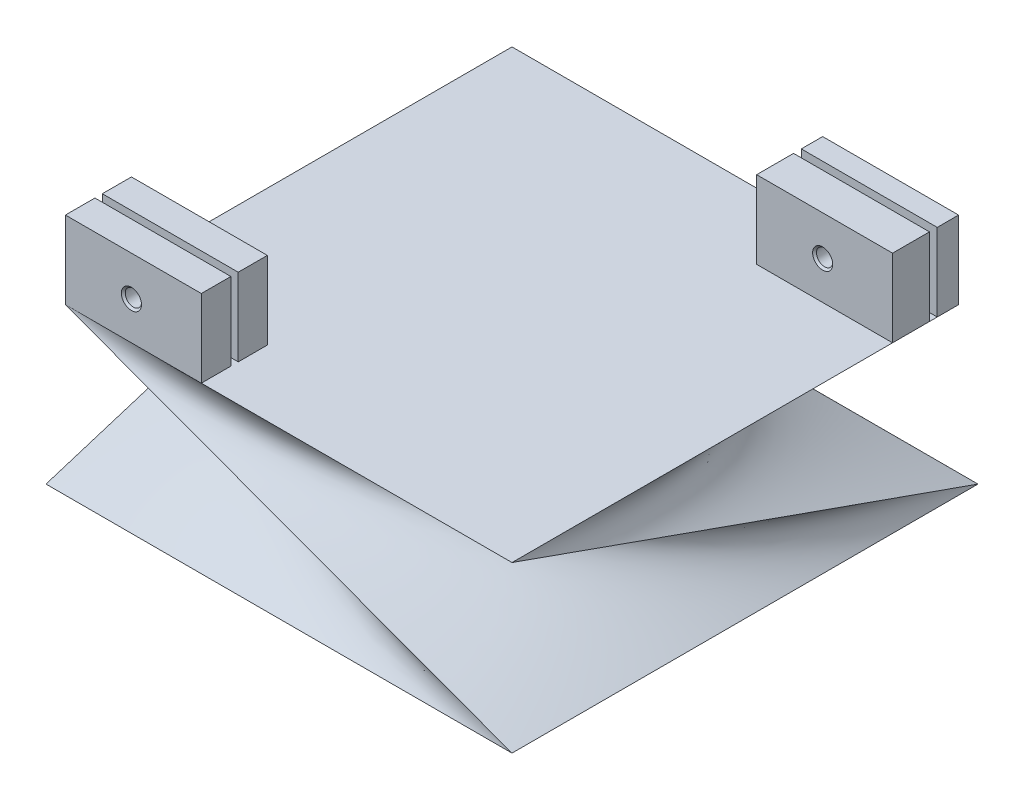
ISO-10303-21;
HEADER;
FILE_DESCRIPTION(('STEP AP214'),'2;1');
FILE_NAME('part.step','',(''),(''),'','','');
FILE_SCHEMA(('AUTOMOTIVE_DESIGN { 1 0 10303 214 1 1 1 1 }'));
ENDSEC;
DATA;
#1=APPLICATION_CONTEXT('core data for automotive mechanical design processes');
#2=APPLICATION_PROTOCOL_DEFINITION('international standard','automotive_design',2000,#1);
#3=PRODUCT_CONTEXT('',#1,'mechanical');
#4=PRODUCT('Part','Part','',(#3));
#5=PRODUCT_RELATED_PRODUCT_CATEGORY('part','',(#4));
#6=PRODUCT_DEFINITION_FORMATION('','',#4);
#7=PRODUCT_DEFINITION_CONTEXT('part definition',#1,'design');
#8=PRODUCT_DEFINITION('design','',#6,#7);
#9=PRODUCT_DEFINITION_SHAPE('','',#8);
#10=(LENGTH_UNIT() NAMED_UNIT(*) SI_UNIT(.MILLI.,.METRE.));
#11=(NAMED_UNIT(*) PLANE_ANGLE_UNIT() SI_UNIT($,.RADIAN.));
#12=(NAMED_UNIT(*) SI_UNIT($,.STERADIAN.) SOLID_ANGLE_UNIT());
#13=UNCERTAINTY_MEASURE_WITH_UNIT(LENGTH_MEASURE(1.E-05),#10,'distance_accuracy_value','');
#14=(GEOMETRIC_REPRESENTATION_CONTEXT(3) GLOBAL_UNCERTAINTY_ASSIGNED_CONTEXT((#13)) GLOBAL_UNIT_ASSIGNED_CONTEXT((#10,
#11,#12)) REPRESENTATION_CONTEXT('',''));
#15=CARTESIAN_POINT('',(0.,0.,0.));
#16=DIRECTION('',(0.,0.,1.));
#17=DIRECTION('',(1.,0.,0.));
#18=AXIS2_PLACEMENT_3D('',#15,#16,#17);
#19=CARTESIAN_POINT('',(-73.025,76.2,73.025));
#20=DIRECTION('',(0.,0.,-1.));
#21=DIRECTION('',(-1.,0.,0.));
#22=AXIS2_PLACEMENT_3D('',#19,#20,#21);
#23=PLANE('',#22);
#24=DIRECTION('',(1.,0.,0.));
#25=VECTOR('',#24,1.);
#26=CARTESIAN_POINT('',(-73.025,50.8,73.025));
#27=LINE('',#26,#25);
#28=CARTESIAN_POINT('',(-73.025,50.8,73.025));
#29=VERTEX_POINT('',#28);
#30=CARTESIAN_POINT('',(-28.575,50.8,73.025));
#31=VERTEX_POINT('',#30);
#32=EDGE_CURVE('E263',#29,#31,#27,.T.);
#33=ORIENTED_EDGE('',*,*,#32,.T.);
#34=DIRECTION('',(0.,-1.,0.));
#35=VECTOR('',#34,1.);
#36=CARTESIAN_POINT('',(-28.575,76.2,73.025));
#37=LINE('',#36,#35);
#38=CARTESIAN_POINT('',(-28.575,76.2,73.025));
#39=VERTEX_POINT('',#38);
#40=EDGE_CURVE('E264',#39,#31,#37,.T.);
#41=ORIENTED_EDGE('',*,*,#40,.F.);
#42=DIRECTION('',(1.,0.,0.));
#43=VECTOR('',#42,1.);
#44=CARTESIAN_POINT('',(-73.025,76.2,73.025));
#45=LINE('',#44,#43);
#46=CARTESIAN_POINT('',(-73.025,76.2,73.025));
#47=VERTEX_POINT('',#46);
#48=EDGE_CURVE('E503',#47,#39,#45,.T.);
#49=ORIENTED_EDGE('',*,*,#48,.F.);
#50=DIRECTION('',(0.,-1.,0.));
#51=VECTOR('',#50,1.);
#52=CARTESIAN_POINT('',(-73.025,76.2,73.025));
#53=LINE('',#52,#51);
#54=EDGE_CURVE('E284',#47,#29,#53,.T.);
#55=ORIENTED_EDGE('',*,*,#54,.T.);
#56=EDGE_LOOP('',(#33,#41,#49,#55));
#57=FACE_BOUND('',#56,.T.);
#58=CARTESIAN_POINT('',(-51.435,63.246,73.025));
#59=DIRECTION('',(0.,0.,1.));
#60=DIRECTION('',(1.,0.,0.));
#61=AXIS2_PLACEMENT_3D('',#58,#59,#60);
#62=CIRCLE('',#61,3.2893);
#63=CARTESIAN_POINT('',(-48.1457,63.246,73.025));
#64=VERTEX_POINT('',#63);
#65=EDGE_CURVE('E462',#64,#64,#62,.T.);
#66=ORIENTED_EDGE('',*,*,#65,.F.);
#67=EDGE_LOOP('',(#66));
#68=FACE_BOUND('',#67,.T.);
#69=ADVANCED_FACE('F44',(#57,#68),#23,.F.);
#70=CARTESIAN_POINT('',(73.025,76.2,-73.025));
#71=DIRECTION('',(-1.,0.,0.));
#72=DIRECTION('',(0.,0.,1.));
#73=AXIS2_PLACEMENT_3D('',#70,#71,#72);
#74=PLANE('',#73);
#75=DIRECTION('',(0.,0.,-1.));
#76=VECTOR('',#75,1.);
#77=CARTESIAN_POINT('',(73.025,76.2,-73.025));
#78=LINE('',#77,#76);
#79=CARTESIAN_POINT('',(73.025,76.2,-66.04));
#80=VERTEX_POINT('',#79);
#81=CARTESIAN_POINT('',(73.025,76.2,-73.025));
#82=VERTEX_POINT('',#81);
#83=EDGE_CURVE('E490',#80,#82,#78,.T.);
#84=ORIENTED_EDGE('',*,*,#83,.F.);
#85=DIRECTION('',(0.,1.,0.));
#86=VECTOR('',#85,1.);
#87=CARTESIAN_POINT('',(73.025,50.8,-66.04));
#88=LINE('',#87,#86);
#89=CARTESIAN_POINT('',(73.025,50.8,-66.04));
#90=VERTEX_POINT('',#89);
#91=EDGE_CURVE('E479',#90,#80,#88,.T.);
#92=ORIENTED_EDGE('',*,*,#91,.F.);
#93=DIRECTION('',(0.,0.,-1.));
#94=VECTOR('',#93,1.);
#95=CARTESIAN_POINT('',(73.025,50.8,-73.025));
#96=LINE('',#95,#94);
#97=CARTESIAN_POINT('',(73.025,50.8,-73.025));
#98=VERTEX_POINT('',#97);
#99=EDGE_CURVE('E206',#90,#98,#96,.T.);
#100=ORIENTED_EDGE('',*,*,#99,.T.);
#101=DIRECTION('',(0.,-1.,0.));
#102=VECTOR('',#101,1.);
#103=CARTESIAN_POINT('',(73.025,76.2,-73.025));
#104=LINE('',#103,#102);
#105=EDGE_CURVE('E300',#82,#98,#104,.T.);
#106=ORIENTED_EDGE('',*,*,#105,.F.);
#107=EDGE_LOOP('',(#84,#92,#100,#106));
#108=FACE_BOUND('',#107,.T.);
#109=ADVANCED_FACE('F652',(#108),#74,.F.);
#110=CARTESIAN_POINT('',(28.575,76.2,-73.025));
#111=DIRECTION('',(1.,0.,0.));
#112=DIRECTION('',(0.,0.,-1.));
#113=AXIS2_PLACEMENT_3D('',#110,#111,#112);
#114=PLANE('',#113);
#115=DIRECTION('',(0.,0.,1.));
#116=VECTOR('',#115,1.);
#117=CARTESIAN_POINT('',(28.575,50.8,-73.025));
#118=LINE('',#117,#116);
#119=CARTESIAN_POINT('',(28.575,50.8,-73.025));
#120=VERTEX_POINT('',#119);
#121=CARTESIAN_POINT('',(28.575,50.8,-66.04));
#122=VERTEX_POINT('',#121);
#123=EDGE_CURVE('E200',#120,#122,#118,.T.);
#124=ORIENTED_EDGE('',*,*,#123,.T.);
#125=DIRECTION('',(0.,1.,0.));
#126=VECTOR('',#125,1.);
#127=CARTESIAN_POINT('',(28.575,50.8,-66.04));
#128=LINE('',#127,#126);
#129=CARTESIAN_POINT('',(28.575,76.2,-66.04));
#130=VERTEX_POINT('',#129);
#131=EDGE_CURVE('E476',#122,#130,#128,.T.);
#132=ORIENTED_EDGE('',*,*,#131,.T.);
#133=DIRECTION('',(0.,0.,1.));
#134=VECTOR('',#133,1.);
#135=CARTESIAN_POINT('',(28.575,76.2,-73.025));
#136=LINE('',#135,#134);
#137=CARTESIAN_POINT('',(28.575,76.2,-73.025));
#138=VERTEX_POINT('',#137);
#139=EDGE_CURVE('E492',#138,#130,#136,.T.);
#140=ORIENTED_EDGE('',*,*,#139,.F.);
#141=DIRECTION('',(0.,-1.,0.));
#142=VECTOR('',#141,1.);
#143=CARTESIAN_POINT('',(28.575,76.2,-73.025));
#144=LINE('',#143,#142);
#145=EDGE_CURVE('E226',#138,#120,#144,.T.);
#146=ORIENTED_EDGE('',*,*,#145,.T.);
#147=EDGE_LOOP('',(#124,#132,#140,#146));
#148=FACE_BOUND('',#147,.T.);
#149=ADVANCED_FACE('F556',(#148),#114,.F.);
#150=CARTESIAN_POINT('',(0.,76.2,0.));
#151=DIRECTION('',(0.,-1.,0.));
#152=DIRECTION('',(0.,0.,-1.));
#153=AXIS2_PLACEMENT_3D('',#150,#151,#152);
#154=PLANE('',#153);
#155=ORIENTED_EDGE('',*,*,#139,.T.);
#156=DIRECTION('',(-1.,0.,0.));
#157=VECTOR('',#156,1.);
#158=CARTESIAN_POINT('',(28.575,76.2,-66.04));
#159=LINE('',#158,#157);
#160=EDGE_CURVE('E184',#80,#130,#159,.T.);
#161=ORIENTED_EDGE('',*,*,#160,.F.);
#162=ORIENTED_EDGE('',*,*,#83,.T.);
#163=DIRECTION('',(-1.,0.,0.));
#164=VECTOR('',#163,1.);
#165=CARTESIAN_POINT('',(73.025,76.2,-73.025));
#166=LINE('',#165,#164);
#167=EDGE_CURVE('E489',#82,#138,#166,.T.);
#168=ORIENTED_EDGE('',*,*,#167,.T.);
#169=EDGE_LOOP('',(#155,#161,#162,#168));
#170=FACE_BOUND('',#169,.T.);
#171=ADVANCED_FACE('F639',(#170),#154,.F.);
#172=CARTESIAN_POINT('',(-73.025,76.2,73.025));
#173=DIRECTION('',(1.,0.,0.));
#174=DIRECTION('',(0.,0.,-1.));
#175=AXIS2_PLACEMENT_3D('',#172,#173,#174);
#176=PLANE('',#175);
#177=DIRECTION('',(0.,0.,1.));
#178=VECTOR('',#177,1.);
#179=CARTESIAN_POINT('',(-73.025,76.2,73.025));
#180=LINE('',#179,#178);
#181=CARTESIAN_POINT('',(-73.025,76.2,63.373));
#182=VERTEX_POINT('',#181);
#183=EDGE_CURVE('E326',#182,#47,#180,.T.);
#184=ORIENTED_EDGE('',*,*,#183,.F.);
#185=DIRECTION('',(0.,1.,0.));
#186=VECTOR('',#185,1.);
#187=CARTESIAN_POINT('',(-73.025,50.8,63.373));
#188=LINE('',#187,#186);
#189=CARTESIAN_POINT('',(-73.025,50.8,63.373));
#190=VERTEX_POINT('',#189);
#191=EDGE_CURVE('E316',#190,#182,#188,.T.);
#192=ORIENTED_EDGE('',*,*,#191,.F.);
#193=DIRECTION('',(0.,0.,1.));
#194=VECTOR('',#193,1.);
#195=CARTESIAN_POINT('',(-73.025,50.8,73.025));
#196=LINE('',#195,#194);
#197=EDGE_CURVE('E298',#190,#29,#196,.T.);
#198=ORIENTED_EDGE('',*,*,#197,.T.);
#199=ORIENTED_EDGE('',*,*,#54,.F.);
#200=EDGE_LOOP('',(#184,#192,#198,#199));
#201=FACE_BOUND('',#200,.T.);
#202=ADVANCED_FACE('F323',(#201),#176,.F.);
#203=CARTESIAN_POINT('',(-28.575,76.2,73.025));
#204=DIRECTION('',(-1.,0.,0.));
#205=DIRECTION('',(0.,0.,1.));
#206=AXIS2_PLACEMENT_3D('',#203,#204,#205);
#207=PLANE('',#206);
#208=DIRECTION('',(0.,0.,-1.));
#209=VECTOR('',#208,1.);
#210=CARTESIAN_POINT('',(-28.575,50.8,73.025));
#211=LINE('',#210,#209);
#212=CARTESIAN_POINT('',(-28.575,50.8,63.373));
#213=VERTEX_POINT('',#212);
#214=EDGE_CURVE('E250',#31,#213,#211,.T.);
#215=ORIENTED_EDGE('',*,*,#214,.T.);
#216=DIRECTION('',(0.,1.,0.));
#217=VECTOR('',#216,1.);
#218=CARTESIAN_POINT('',(-28.575,50.8,63.373));
#219=LINE('',#218,#217);
#220=CARTESIAN_POINT('',(-28.575,76.2,63.373));
#221=VERTEX_POINT('',#220);
#222=EDGE_CURVE('E319',#213,#221,#219,.T.);
#223=ORIENTED_EDGE('',*,*,#222,.T.);
#224=DIRECTION('',(0.,0.,-1.));
#225=VECTOR('',#224,1.);
#226=CARTESIAN_POINT('',(-28.575,76.2,73.025));
#227=LINE('',#226,#225);
#228=EDGE_CURVE('E506',#39,#221,#227,.T.);
#229=ORIENTED_EDGE('',*,*,#228,.F.);
#230=ORIENTED_EDGE('',*,*,#40,.T.);
#231=EDGE_LOOP('',(#215,#223,#229,#230));
#232=FACE_BOUND('',#231,.T.);
#233=ADVANCED_FACE('F591',(#232),#207,.F.);
#234=CARTESIAN_POINT('',(0.,76.2,0.));
#235=DIRECTION('',(0.,-1.,0.));
#236=DIRECTION('',(0.,0.,-1.));
#237=AXIS2_PLACEMENT_3D('',#234,#235,#236);
#238=PLANE('',#237);
#239=ORIENTED_EDGE('',*,*,#228,.T.);
#240=DIRECTION('',(1.,0.,0.));
#241=VECTOR('',#240,1.);
#242=CARTESIAN_POINT('',(-73.025,76.2,63.373));
#243=LINE('',#242,#241);
#244=EDGE_CURVE('E482',#182,#221,#243,.T.);
#245=ORIENTED_EDGE('',*,*,#244,.F.);
#246=ORIENTED_EDGE('',*,*,#183,.T.);
#247=ORIENTED_EDGE('',*,*,#48,.T.);
#248=EDGE_LOOP('',(#239,#245,#246,#247));
#249=FACE_BOUND('',#248,.T.);
#250=ADVANCED_FACE('F678',(#249),#238,.F.);
#251=CARTESIAN_POINT('',(0.,50.8,0.));
#252=DIRECTION('',(0.,-1.,0.));
#253=DIRECTION('',(0.,0.,-1.));
#254=AXIS2_PLACEMENT_3D('',#251,#252,#253);
#255=PLANE('',#254);
#256=ORIENTED_EDGE('',*,*,#123,.F.);
#257=DIRECTION('',(-1.,0.,0.));
#258=VECTOR('',#257,1.);
#259=CARTESIAN_POINT('',(-73.025,50.8,-73.025));
#260=LINE('',#259,#258);
#261=CARTESIAN_POINT('',(-73.025,50.8,-73.025));
#262=VERTEX_POINT('',#261);
#263=EDGE_CURVE('E220',#120,#262,#260,.T.);
#264=ORIENTED_EDGE('',*,*,#263,.T.);
#265=DIRECTION('',(0.,0.,1.));
#266=VECTOR('',#265,1.);
#267=CARTESIAN_POINT('',(-73.025,50.8,73.025));
#268=LINE('',#267,#266);
#269=CARTESIAN_POINT('',(-73.025,50.8,51.435));
#270=VERTEX_POINT('',#269);
#271=EDGE_CURVE('E242',#262,#270,#268,.T.);
#272=ORIENTED_EDGE('',*,*,#271,.T.);
#273=DIRECTION('',(-1.,0.,0.));
#274=VECTOR('',#273,1.);
#275=CARTESIAN_POINT('',(-73.025,50.8,51.435));
#276=LINE('',#275,#274);
#277=CARTESIAN_POINT('',(-28.575,50.8,51.435));
#278=VERTEX_POINT('',#277);
#279=EDGE_CURVE('E517',#278,#270,#276,.T.);
#280=ORIENTED_EDGE('',*,*,#279,.F.);
#281=CARTESIAN_POINT('',(-28.575,50.8,60.96));
#282=VERTEX_POINT('',#281);
#283=EDGE_CURVE('E247',#282,#278,#211,.T.);
#284=ORIENTED_EDGE('',*,*,#283,.F.);
#285=DIRECTION('',(-1.,0.,0.));
#286=VECTOR('',#285,1.);
#287=CARTESIAN_POINT('',(-28.575,50.8,60.96));
#288=LINE('',#287,#286);
#289=CARTESIAN_POINT('',(-73.025,50.8,60.96));
#290=VERTEX_POINT('',#289);
#291=EDGE_CURVE('E310',#282,#290,#288,.T.);
#292=ORIENTED_EDGE('',*,*,#291,.T.);
#293=DIRECTION('',(0.,0.,1.));
#294=VECTOR('',#293,1.);
#295=CARTESIAN_POINT('',(-73.025,50.8,60.96));
#296=LINE('',#295,#294);
#297=EDGE_CURVE('E301',#290,#190,#296,.T.);
#298=ORIENTED_EDGE('',*,*,#297,.T.);
#299=DIRECTION('',(1.,0.,0.));
#300=VECTOR('',#299,1.);
#301=CARTESIAN_POINT('',(-73.025,50.8,63.373));
#302=LINE('',#301,#300);
#303=EDGE_CURVE('E307',#190,#213,#302,.T.);
#304=ORIENTED_EDGE('',*,*,#303,.T.);
#305=ORIENTED_EDGE('',*,*,#214,.F.);
#306=CARTESIAN_POINT('',(73.025,50.8,73.025));
#307=VERTEX_POINT('',#306);
#308=EDGE_CURVE('E259',#31,#307,#27,.T.);
#309=ORIENTED_EDGE('',*,*,#308,.T.);
#310=DIRECTION('',(0.,0.,-1.));
#311=VECTOR('',#310,1.);
#312=CARTESIAN_POINT('',(73.025,50.8,73.025));
#313=LINE('',#312,#311);
#314=CARTESIAN_POINT('',(73.025,50.8,-51.435));
#315=VERTEX_POINT('',#314);
#316=EDGE_CURVE('E225',#307,#315,#313,.T.);
#317=ORIENTED_EDGE('',*,*,#316,.T.);
#318=DIRECTION('',(1.,0.,0.));
#319=VECTOR('',#318,1.);
#320=CARTESIAN_POINT('',(73.025,50.8,-51.435));
#321=LINE('',#320,#319);
#322=CARTESIAN_POINT('',(28.575,50.8,-51.435));
#323=VERTEX_POINT('',#322);
#324=EDGE_CURVE('E198',#323,#315,#321,.T.);
#325=ORIENTED_EDGE('',*,*,#324,.F.);
#326=CARTESIAN_POINT('',(28.575,50.8,-63.5));
#327=VERTEX_POINT('',#326);
#328=EDGE_CURVE('E190',#327,#323,#118,.T.);
#329=ORIENTED_EDGE('',*,*,#328,.F.);
#330=DIRECTION('',(1.,0.,0.));
#331=VECTOR('',#330,1.);
#332=CARTESIAN_POINT('',(73.025,50.8,-63.5));
#333=LINE('',#332,#331);
#334=CARTESIAN_POINT('',(73.025,50.8,-63.5));
#335=VERTEX_POINT('',#334);
#336=EDGE_CURVE('E176',#327,#335,#333,.T.);
#337=ORIENTED_EDGE('',*,*,#336,.T.);
#338=DIRECTION('',(0.,0.,-1.));
#339=VECTOR('',#338,1.);
#340=CARTESIAN_POINT('',(73.025,50.8,-66.04));
#341=LINE('',#340,#339);
#342=EDGE_CURVE('E183',#335,#90,#341,.T.);
#343=ORIENTED_EDGE('',*,*,#342,.T.);
#344=DIRECTION('',(-1.,0.,0.));
#345=VECTOR('',#344,1.);
#346=CARTESIAN_POINT('',(28.575,50.8,-66.04));
#347=LINE('',#346,#345);
#348=EDGE_CURVE('E193',#90,#122,#347,.T.);
#349=ORIENTED_EDGE('',*,*,#348,.T.);
#350=EDGE_LOOP('',(#256,#264,#272,#280,#284,#292,#298,#304,#305,#309,#317,#325,#329,#337,#343,#349));
#351=FACE_BOUND('',#350,.T.);
#352=ADVANCED_FACE('F195',(#351),#255,.F.);
#353=CARTESIAN_POINT('',(0.,0.,0.));
#354=DIRECTION('',(0.,-1.,0.));
#355=DIRECTION('',(0.,0.,-1.));
#356=AXIS2_PLACEMENT_3D('',#353,#354,#355);
#357=PLANE('',#356);
#358=DIRECTION('',(0.,0.,-1.));
#359=VECTOR('',#358,1.);
#360=CARTESIAN_POINT('',(76.2,0.,76.2));
#361=LINE('',#360,#359);
#362=CARTESIAN_POINT('',(76.2,0.,76.2));
#363=VERTEX_POINT('',#362);
#364=CARTESIAN_POINT('',(76.2,0.,-76.2));
#365=VERTEX_POINT('',#364);
#366=EDGE_CURVE('E945',#363,#365,#361,.T.);
#367=ORIENTED_EDGE('',*,*,#366,.F.);
#368=DIRECTION('',(1.,0.,0.));
#369=VECTOR('',#368,1.);
#370=CARTESIAN_POINT('',(-76.2,0.,76.2));
#371=LINE('',#370,#369);
#372=CARTESIAN_POINT('',(-76.2,0.,76.2));
#373=VERTEX_POINT('',#372);
#374=EDGE_CURVE('E12',#373,#363,#371,.T.);
#375=ORIENTED_EDGE('',*,*,#374,.F.);
#376=DIRECTION('',(0.,0.,1.));
#377=VECTOR('',#376,1.);
#378=CARTESIAN_POINT('',(-76.2,0.,76.2));
#379=LINE('',#378,#377);
#380=CARTESIAN_POINT('',(-76.2,0.,-76.2));
#381=VERTEX_POINT('',#380);
#382=EDGE_CURVE('E54',#381,#373,#379,.T.);
#383=ORIENTED_EDGE('',*,*,#382,.F.);
#384=DIRECTION('',(-1.,0.,0.));
#385=VECTOR('',#384,1.);
#386=CARTESIAN_POINT('',(-76.2,0.,-76.2));
#387=LINE('',#386,#385);
#388=EDGE_CURVE('E948',#365,#381,#387,.T.);
#389=ORIENTED_EDGE('',*,*,#388,.F.);
#390=EDGE_LOOP('',(#367,#375,#383,#389));
#391=FACE_BOUND('',#390,.T.);
#392=ADVANCED_FACE('F46',(#391),#357,.T.);
#393=CARTESIAN_POINT('',(-73.025,50.8,-73.025));
#394=CARTESIAN_POINT('',(-76.2,0.,76.2));
#395=CARTESIAN_POINT('',(-48.6833333333333,50.8,-73.025));
#396=CARTESIAN_POINT('',(-76.2,0.,50.7999999999999));
#397=CARTESIAN_POINT('',(-24.3416666666667,50.8,-73.025));
#398=CARTESIAN_POINT('',(-76.2,0.,25.3999999999999));
#399=CARTESIAN_POINT('',(24.3416666666667,50.8,-73.025));
#400=CARTESIAN_POINT('',(-76.2,0.,-25.4000000000001));
#401=CARTESIAN_POINT('',(48.6833333333333,50.8,-73.025));
#402=CARTESIAN_POINT('',(-76.2,0.,-50.8));
#403=CARTESIAN_POINT('',(73.025,50.8,-73.025));
#404=CARTESIAN_POINT('',(-76.2,0.,-76.1999999999999));
#405=B_SPLINE_SURFACE_WITH_KNOTS('',3,1,((#393,#394),(#395,#396),(#397,#398),(#399,#400),(#401,
#402),(#403,#404)),.UNSPECIFIED.,.F.,.F.,.F.,(4,2,4),(2,2),(0.,0.5,1.),(0.,1.),.UNSPECIFIED.);
#406=EDGE_CURVE('E224',#98,#120,#260,.T.);
#407=DIRECTION('',(-0.946457946217277,-0.322198449776094,-0.0201374031110055));
#408=VECTOR('',#407,1.);
#409=CARTESIAN_POINT('',(-1.58750000000001,25.4,-74.6125));
#410=LINE('',#409,#408);
#411=EDGE_CURVE('E414',#98,#381,#410,.T.);
#412=DIRECTION('',(0.0201374031110061,0.322198449776094,-0.946457946217277));
#413=VECTOR('',#412,1.);
#414=CARTESIAN_POINT('',(-74.6125,25.4,1.58750000000001));
#415=LINE('',#414,#413);
#416=EDGE_CURVE('E279',#373,#262,#415,.T.);
#417=ORIENTED_EDGE('',*,*,#406,.F.);
#418=ORIENTED_EDGE('',*,*,#411,.T.);
#419=ORIENTED_EDGE('',*,*,#382,.T.);
#420=ORIENTED_EDGE('',*,*,#416,.T.);
#421=ORIENTED_EDGE('',*,*,#263,.F.);
#422=EDGE_LOOP('',(#417,#418,#419,#420,#421));
#423=FACE_BOUND('',#422,.T.);
#424=ADVANCED_FACE('F390',(#423),#405,.T.);
#425=CARTESIAN_POINT('',(73.025,50.8,-73.025));
#426=CARTESIAN_POINT('',(-76.2,0.,-76.2));
#427=CARTESIAN_POINT('',(73.025,50.8,-48.6833333333333));
#428=CARTESIAN_POINT('',(-50.7999999999999,0.,-76.2));
#429=CARTESIAN_POINT('',(73.025,50.8,-24.3416666666667));
#430=CARTESIAN_POINT('',(-25.3999999999999,0.,-76.2));
#431=CARTESIAN_POINT('',(73.025,50.8,24.3416666666667));
#432=CARTESIAN_POINT('',(25.4000000000001,0.,-76.2));
#433=CARTESIAN_POINT('',(73.025,50.8,48.6833333333333));
#434=CARTESIAN_POINT('',(50.8000000000001,0.,-76.2));
#435=CARTESIAN_POINT('',(73.025,50.8,73.025));
#436=CARTESIAN_POINT('',(76.2,0.,-76.2));
#437=B_SPLINE_SURFACE_WITH_KNOTS('',3,1,((#425,#426),(#427,#428),(#429,#430),(#431,#432),(#433,
#434),(#435,#436)),.UNSPECIFIED.,.F.,.F.,.F.,(4,2,4),(2,2),(0.,0.5,1.),(0.,1.),.UNSPECIFIED.);
#438=DIRECTION('',(0.0201374031110061,-0.322198449776094,-0.946457946217277));
#439=VECTOR('',#438,1.);
#440=CARTESIAN_POINT('',(74.6125,25.4,-1.5875));
#441=LINE('',#440,#439);
#442=EDGE_CURVE('E564',#307,#365,#441,.T.);
#443=EDGE_CURVE('E201',#315,#335,#96,.T.);
#444=ORIENTED_EDGE('',*,*,#316,.F.);
#445=ORIENTED_EDGE('',*,*,#442,.T.);
#446=ORIENTED_EDGE('',*,*,#388,.T.);
#447=ORIENTED_EDGE('',*,*,#411,.F.);
#448=ORIENTED_EDGE('',*,*,#99,.F.);
#449=ORIENTED_EDGE('',*,*,#342,.F.);
#450=ORIENTED_EDGE('',*,*,#443,.F.);
#451=EDGE_LOOP('',(#444,#445,#446,#447,#448,#449,#450));
#452=FACE_BOUND('',#451,.T.);
#453=ADVANCED_FACE('F355',(#452),#437,.T.);
#454=CARTESIAN_POINT('',(-73.025,50.8,73.025));
#455=CARTESIAN_POINT('',(76.2,0.,76.2));
#456=CARTESIAN_POINT('',(-73.025,50.8,48.6833333333333));
#457=CARTESIAN_POINT('',(50.8000000000007,0.,76.2));
#458=CARTESIAN_POINT('',(-73.025,50.8,24.3416666666667));
#459=CARTESIAN_POINT('',(25.4000000000011,0.,76.2));
#460=CARTESIAN_POINT('',(-73.025,50.8,-24.3416666666667));
#461=CARTESIAN_POINT('',(-25.3999999999989,0.,76.2));
#462=CARTESIAN_POINT('',(-73.025,50.8,-48.6833333333333));
#463=CARTESIAN_POINT('',(-50.7999999999993,0.,76.2));
#464=CARTESIAN_POINT('',(-73.025,50.8,-73.025));
#465=CARTESIAN_POINT('',(-76.2,0.,76.2));
#466=B_SPLINE_SURFACE_WITH_KNOTS('',3,1,((#454,#455),(#456,#457),(#458,#459),(#460,#461),(#462,
#463),(#464,#465)),.UNSPECIFIED.,.F.,.F.,.F.,(4,2,4),(2,2),(0.,0.5,1.),(0.,1.),.UNSPECIFIED.);
#467=DIRECTION('',(0.946457946217277,-0.322198449776094,0.0201374031110061));
#468=VECTOR('',#467,1.);
#469=CARTESIAN_POINT('',(1.58750000000001,25.4,74.6125));
#470=LINE('',#469,#468);
#471=EDGE_CURVE('E331',#29,#363,#470,.T.);
#472=EDGE_CURVE('E251',#270,#290,#196,.T.);
#473=ORIENTED_EDGE('',*,*,#271,.F.);
#474=ORIENTED_EDGE('',*,*,#416,.F.);
#475=ORIENTED_EDGE('',*,*,#374,.T.);
#476=ORIENTED_EDGE('',*,*,#471,.F.);
#477=ORIENTED_EDGE('',*,*,#197,.F.);
#478=ORIENTED_EDGE('',*,*,#297,.F.);
#479=ORIENTED_EDGE('',*,*,#472,.F.);
#480=EDGE_LOOP('',(#473,#474,#475,#476,#477,#478,#479));
#481=FACE_BOUND('',#480,.T.);
#482=ADVANCED_FACE('F330',(#481),#466,.T.);
#483=CARTESIAN_POINT('',(73.025,50.8,73.025));
#484=CARTESIAN_POINT('',(76.2,0.,-76.1999999999999));
#485=CARTESIAN_POINT('',(48.6833333333333,50.8,73.025));
#486=CARTESIAN_POINT('',(76.2,0.,-50.7999999999999));
#487=CARTESIAN_POINT('',(24.3416666666667,50.8,73.025));
#488=CARTESIAN_POINT('',(76.2,0.,-25.4));
#489=CARTESIAN_POINT('',(-24.3416666666667,50.8,73.025));
#490=CARTESIAN_POINT('',(76.2,0.,25.4));
#491=CARTESIAN_POINT('',(-48.6833333333333,50.8,73.025));
#492=CARTESIAN_POINT('',(76.2,0.,50.8));
#493=CARTESIAN_POINT('',(-73.025,50.8,73.025));
#494=CARTESIAN_POINT('',(76.2,0.,76.2));
#495=B_SPLINE_SURFACE_WITH_KNOTS('',3,1,((#483,#484),(#485,#486),(#487,#488),(#489,#490),(#491,
#492),(#493,#494)),.UNSPECIFIED.,.F.,.F.,.F.,(4,2,4),(2,2),(0.,0.5,1.),(0.,1.),.UNSPECIFIED.);
#496=ORIENTED_EDGE('',*,*,#32,.F.);
#497=ORIENTED_EDGE('',*,*,#471,.T.);
#498=ORIENTED_EDGE('',*,*,#366,.T.);
#499=ORIENTED_EDGE('',*,*,#442,.F.);
#500=ORIENTED_EDGE('',*,*,#308,.F.);
#501=EDGE_LOOP('',(#496,#497,#498,#499,#500));
#502=FACE_BOUND('',#501,.T.);
#503=ADVANCED_FACE('F354',(#502),#495,.T.);
#504=ORIENTED_EDGE('',*,*,#472,.T.);
#505=DIRECTION('',(0.,1.,0.));
#506=VECTOR('',#505,1.);
#507=CARTESIAN_POINT('',(-73.025,50.8,60.96));
#508=LINE('',#507,#506);
#509=CARTESIAN_POINT('',(-73.025,76.2,60.96));
#510=VERTEX_POINT('',#509);
#511=EDGE_CURVE('E327',#290,#510,#508,.T.);
#512=ORIENTED_EDGE('',*,*,#511,.T.);
#513=CARTESIAN_POINT('',(-73.025,76.2,51.435));
#514=VERTEX_POINT('',#513);
#515=EDGE_CURVE('E500',#514,#510,#180,.T.);
#516=ORIENTED_EDGE('',*,*,#515,.F.);
#517=DIRECTION('',(0.,-1.,0.));
#518=VECTOR('',#517,1.);
#519=CARTESIAN_POINT('',(-73.025,76.2,51.435));
#520=LINE('',#519,#518);
#521=EDGE_CURVE('E511',#514,#270,#520,.T.);
#522=ORIENTED_EDGE('',*,*,#521,.T.);
#523=EDGE_LOOP('',(#504,#512,#516,#522));
#524=FACE_BOUND('',#523,.T.);
#525=ADVANCED_FACE('F580',(#524),#176,.F.);
#526=CARTESIAN_POINT('',(-28.575,76.2,60.96));
#527=VERTEX_POINT('',#526);
#528=CARTESIAN_POINT('',(-28.575,76.2,51.435));
#529=VERTEX_POINT('',#528);
#530=EDGE_CURVE('E505',#527,#529,#227,.T.);
#531=ORIENTED_EDGE('',*,*,#530,.F.);
#532=DIRECTION('',(0.,1.,0.));
#533=VECTOR('',#532,1.);
#534=CARTESIAN_POINT('',(-28.575,50.8,60.96));
#535=LINE('',#534,#533);
#536=EDGE_CURVE('E70',#282,#527,#535,.T.);
#537=ORIENTED_EDGE('',*,*,#536,.F.);
#538=ORIENTED_EDGE('',*,*,#283,.T.);
#539=DIRECTION('',(0.,-1.,0.));
#540=VECTOR('',#539,1.);
#541=CARTESIAN_POINT('',(-28.575,76.2,51.435));
#542=LINE('',#541,#540);
#543=EDGE_CURVE('E514',#529,#278,#542,.T.);
#544=ORIENTED_EDGE('',*,*,#543,.F.);
#545=EDGE_LOOP('',(#531,#537,#538,#544));
#546=FACE_BOUND('',#545,.T.);
#547=ADVANCED_FACE('F586',(#546),#207,.F.);
#548=CARTESIAN_POINT('',(-73.025,76.2,51.435));
#549=DIRECTION('',(0.,0.,1.));
#550=DIRECTION('',(1.,0.,0.));
#551=AXIS2_PLACEMENT_3D('',#548,#549,#550);
#552=PLANE('',#551);
#553=CARTESIAN_POINT('',(-51.435,63.246,51.435));
#554=DIRECTION('',(0.,0.,1.));
#555=DIRECTION('',(1.,0.,0.));
#556=AXIS2_PLACEMENT_3D('',#553,#554,#555);
#557=CIRCLE('',#556,2.65429999999998);
#558=CARTESIAN_POINT('',(-48.7807,63.246,51.435));
#559=VERTEX_POINT('',#558);
#560=EDGE_CURVE('E454',#559,#559,#557,.T.);
#561=ORIENTED_EDGE('',*,*,#560,.T.);
#562=EDGE_LOOP('',(#561));
#563=FACE_BOUND('',#562,.T.);
#564=ORIENTED_EDGE('',*,*,#279,.T.);
#565=ORIENTED_EDGE('',*,*,#521,.F.);
#566=DIRECTION('',(-1.,0.,0.));
#567=VECTOR('',#566,1.);
#568=CARTESIAN_POINT('',(-73.025,76.2,51.435));
#569=LINE('',#568,#567);
#570=EDGE_CURVE('E509',#529,#514,#569,.T.);
#571=ORIENTED_EDGE('',*,*,#570,.F.);
#572=ORIENTED_EDGE('',*,*,#543,.T.);
#573=EDGE_LOOP('',(#564,#565,#571,#572));
#574=FACE_BOUND('',#573,.T.);
#575=ADVANCED_FACE('F575',(#563,#574),#552,.F.);
#576=ORIENTED_EDGE('',*,*,#515,.T.);
#577=DIRECTION('',(-1.,0.,0.));
#578=VECTOR('',#577,1.);
#579=CARTESIAN_POINT('',(-28.575,76.2,60.96));
#580=LINE('',#579,#578);
#581=EDGE_CURVE('E478',#527,#510,#580,.T.);
#582=ORIENTED_EDGE('',*,*,#581,.F.);
#583=ORIENTED_EDGE('',*,*,#530,.T.);
#584=ORIENTED_EDGE('',*,*,#570,.T.);
#585=EDGE_LOOP('',(#576,#582,#583,#584));
#586=FACE_BOUND('',#585,.T.);
#587=ADVANCED_FACE('F583',(#586),#238,.F.);
#588=ORIENTED_EDGE('',*,*,#443,.T.);
#589=DIRECTION('',(0.,1.,0.));
#590=VECTOR('',#589,1.);
#591=CARTESIAN_POINT('',(73.025,50.8,-63.5));
#592=LINE('',#591,#590);
#593=CARTESIAN_POINT('',(73.025,76.2,-63.5));
#594=VERTEX_POINT('',#593);
#595=EDGE_CURVE('E179',#335,#594,#592,.T.);
#596=ORIENTED_EDGE('',*,*,#595,.T.);
#597=CARTESIAN_POINT('',(73.025,76.2,-51.435));
#598=VERTEX_POINT('',#597);
#599=EDGE_CURVE('E486',#598,#594,#78,.T.);
#600=ORIENTED_EDGE('',*,*,#599,.F.);
#601=DIRECTION('',(0.,-1.,0.));
#602=VECTOR('',#601,1.);
#603=CARTESIAN_POINT('',(73.025,76.2,-51.435));
#604=LINE('',#603,#602);
#605=EDGE_CURVE('E497',#598,#315,#604,.T.);
#606=ORIENTED_EDGE('',*,*,#605,.T.);
#607=EDGE_LOOP('',(#588,#596,#600,#606));
#608=FACE_BOUND('',#607,.T.);
#609=ADVANCED_FACE('F631',(#608),#74,.F.);
#610=CARTESIAN_POINT('',(73.025,76.2,-73.025));
#611=DIRECTION('',(0.,0.,1.));
#612=DIRECTION('',(1.,0.,0.));
#613=AXIS2_PLACEMENT_3D('',#610,#611,#612);
#614=PLANE('',#613);
#615=CARTESIAN_POINT('',(50.165,63.246,-73.025));
#616=DIRECTION('',(0.,0.,1.));
#617=DIRECTION('',(1.,0.,0.));
#618=AXIS2_PLACEMENT_3D('',#615,#616,#617);
#619=CIRCLE('',#618,2.65429999999999);
#620=CARTESIAN_POINT('',(52.8193,63.246,-73.025));
#621=VERTEX_POINT('',#620);
#622=EDGE_CURVE('E745',#621,#621,#619,.T.);
#623=ORIENTED_EDGE('',*,*,#622,.T.);
#624=EDGE_LOOP('',(#623));
#625=FACE_BOUND('',#624,.T.);
#626=ORIENTED_EDGE('',*,*,#406,.T.);
#627=ORIENTED_EDGE('',*,*,#145,.F.);
#628=ORIENTED_EDGE('',*,*,#167,.F.);
#629=ORIENTED_EDGE('',*,*,#105,.T.);
#630=EDGE_LOOP('',(#626,#627,#628,#629));
#631=FACE_BOUND('',#630,.T.);
#632=ADVANCED_FACE('F561',(#625,#631),#614,.F.);
#633=CARTESIAN_POINT('',(28.575,76.2,-63.5));
#634=VERTEX_POINT('',#633);
#635=CARTESIAN_POINT('',(28.575,76.2,-51.435));
#636=VERTEX_POINT('',#635);
#637=EDGE_CURVE('E192',#634,#636,#136,.T.);
#638=ORIENTED_EDGE('',*,*,#637,.F.);
#639=DIRECTION('',(0.,1.,0.));
#640=VECTOR('',#639,1.);
#641=CARTESIAN_POINT('',(28.575,50.8,-63.5));
#642=LINE('',#641,#640);
#643=EDGE_CURVE('E62',#327,#634,#642,.T.);
#644=ORIENTED_EDGE('',*,*,#643,.F.);
#645=ORIENTED_EDGE('',*,*,#328,.T.);
#646=DIRECTION('',(0.,-1.,0.));
#647=VECTOR('',#646,1.);
#648=CARTESIAN_POINT('',(28.575,76.2,-51.435));
#649=LINE('',#648,#647);
#650=EDGE_CURVE('E498',#636,#323,#649,.T.);
#651=ORIENTED_EDGE('',*,*,#650,.F.);
#652=EDGE_LOOP('',(#638,#644,#645,#651));
#653=FACE_BOUND('',#652,.T.);
#654=ADVANCED_FACE('F188',(#653),#114,.F.);
#655=CARTESIAN_POINT('',(73.025,76.2,-51.435));
#656=DIRECTION('',(0.,0.,-1.));
#657=DIRECTION('',(-1.,0.,0.));
#658=AXIS2_PLACEMENT_3D('',#655,#656,#657);
#659=PLANE('',#658);
#660=CARTESIAN_POINT('',(50.165,63.246,-51.435));
#661=DIRECTION('',(0.,0.,1.));
#662=DIRECTION('',(1.,0.,0.));
#663=AXIS2_PLACEMENT_3D('',#660,#661,#662);
#664=CIRCLE('',#663,3.2893);
#665=CARTESIAN_POINT('',(53.4543,63.246,-51.435));
#666=VERTEX_POINT('',#665);
#667=EDGE_CURVE('E741',#666,#666,#664,.T.);
#668=ORIENTED_EDGE('',*,*,#667,.F.);
#669=EDGE_LOOP('',(#668));
#670=FACE_BOUND('',#669,.T.);
#671=ORIENTED_EDGE('',*,*,#324,.T.);
#672=ORIENTED_EDGE('',*,*,#605,.F.);
#673=DIRECTION('',(1.,0.,0.));
#674=VECTOR('',#673,1.);
#675=CARTESIAN_POINT('',(73.025,76.2,-51.435));
#676=LINE('',#675,#674);
#677=EDGE_CURVE('E495',#636,#598,#676,.T.);
#678=ORIENTED_EDGE('',*,*,#677,.F.);
#679=ORIENTED_EDGE('',*,*,#650,.T.);
#680=EDGE_LOOP('',(#671,#672,#678,#679));
#681=FACE_BOUND('',#680,.T.);
#682=ADVANCED_FACE('F634',(#670,#681),#659,.F.);
#683=ORIENTED_EDGE('',*,*,#599,.T.);
#684=DIRECTION('',(1.,0.,0.));
#685=VECTOR('',#684,1.);
#686=CARTESIAN_POINT('',(73.025,76.2,-63.5));
#687=LINE('',#686,#685);
#688=EDGE_CURVE('E473',#634,#594,#687,.T.);
#689=ORIENTED_EDGE('',*,*,#688,.F.);
#690=ORIENTED_EDGE('',*,*,#637,.T.);
#691=ORIENTED_EDGE('',*,*,#677,.T.);
#692=EDGE_LOOP('',(#683,#689,#690,#691));
#693=FACE_BOUND('',#692,.T.);
#694=ADVANCED_FACE('F636',(#693),#154,.F.);
#695=CARTESIAN_POINT('',(-73.025,50.8,63.373));
#696=DIRECTION('',(0.,0.,1.));
#697=DIRECTION('',(1.,0.,0.));
#698=AXIS2_PLACEMENT_3D('',#695,#696,#697);
#699=PLANE('',#698);
#700=CARTESIAN_POINT('',(-51.435,63.246,63.373));
#701=DIRECTION('',(0.,0.,1.));
#702=DIRECTION('',(1.,0.,0.));
#703=AXIS2_PLACEMENT_3D('',#700,#701,#702);
#704=CIRCLE('',#703,2.65429999999998);
#705=CARTESIAN_POINT('',(-48.7807,63.246,63.373));
#706=VERTEX_POINT('',#705);
#707=EDGE_CURVE('E447',#706,#706,#704,.T.);
#708=ORIENTED_EDGE('',*,*,#707,.T.);
#709=EDGE_LOOP('',(#708));
#710=FACE_BOUND('',#709,.T.);
#711=ORIENTED_EDGE('',*,*,#244,.T.);
#712=ORIENTED_EDGE('',*,*,#222,.F.);
#713=ORIENTED_EDGE('',*,*,#303,.F.);
#714=ORIENTED_EDGE('',*,*,#191,.T.);
#715=EDGE_LOOP('',(#711,#712,#713,#714));
#716=FACE_BOUND('',#715,.T.);
#717=ADVANCED_FACE('F315',(#710,#716),#699,.F.);
#718=CARTESIAN_POINT('',(-28.575,50.8,60.96));
#719=DIRECTION('',(0.,0.,-1.));
#720=DIRECTION('',(-1.,0.,0.));
#721=AXIS2_PLACEMENT_3D('',#718,#719,#720);
#722=PLANE('',#721);
#723=CARTESIAN_POINT('',(-51.435,63.246,60.96));
#724=DIRECTION('',(0.,0.,-1.));
#725=DIRECTION('',(-1.,0.,0.));
#726=AXIS2_PLACEMENT_3D('',#723,#724,#725);
#727=CIRCLE('',#726,2.65429999999998);
#728=CARTESIAN_POINT('',(-54.0893,63.246,60.96));
#729=VERTEX_POINT('',#728);
#730=EDGE_CURVE('E459',#729,#729,#727,.T.);
#731=ORIENTED_EDGE('',*,*,#730,.T.);
#732=EDGE_LOOP('',(#731));
#733=FACE_BOUND('',#732,.T.);
#734=ORIENTED_EDGE('',*,*,#581,.T.);
#735=ORIENTED_EDGE('',*,*,#511,.F.);
#736=ORIENTED_EDGE('',*,*,#291,.F.);
#737=ORIENTED_EDGE('',*,*,#536,.T.);
#738=EDGE_LOOP('',(#734,#735,#736,#737));
#739=FACE_BOUND('',#738,.T.);
#740=ADVANCED_FACE('F644',(#733,#739),#722,.F.);
#741=CARTESIAN_POINT('',(28.575,50.8,-66.04));
#742=DIRECTION('',(0.,0.,-1.));
#743=DIRECTION('',(-1.,0.,0.));
#744=AXIS2_PLACEMENT_3D('',#741,#742,#743);
#745=PLANE('',#744);
#746=CARTESIAN_POINT('',(50.165,63.246,-66.04));
#747=DIRECTION('',(0.,0.,-1.));
#748=DIRECTION('',(-1.,0.,0.));
#749=AXIS2_PLACEMENT_3D('',#746,#747,#748);
#750=CIRCLE('',#749,2.65429999999999);
#751=CARTESIAN_POINT('',(47.5107,63.246,-66.04));
#752=VERTEX_POINT('',#751);
#753=EDGE_CURVE('E467',#752,#752,#750,.T.);
#754=ORIENTED_EDGE('',*,*,#753,.T.);
#755=EDGE_LOOP('',(#754));
#756=FACE_BOUND('',#755,.T.);
#757=ORIENTED_EDGE('',*,*,#160,.T.);
#758=ORIENTED_EDGE('',*,*,#131,.F.);
#759=ORIENTED_EDGE('',*,*,#348,.F.);
#760=ORIENTED_EDGE('',*,*,#91,.T.);
#761=EDGE_LOOP('',(#757,#758,#759,#760));
#762=FACE_BOUND('',#761,.T.);
#763=ADVANCED_FACE('F706',(#756,#762),#745,.F.);
#764=CARTESIAN_POINT('',(73.025,50.8,-63.5));
#765=DIRECTION('',(0.,0.,1.));
#766=DIRECTION('',(1.,0.,0.));
#767=AXIS2_PLACEMENT_3D('',#764,#765,#766);
#768=PLANE('',#767);
#769=CARTESIAN_POINT('',(50.165,63.246,-63.5));
#770=DIRECTION('',(0.,0.,1.));
#771=DIRECTION('',(1.,0.,0.));
#772=AXIS2_PLACEMENT_3D('',#769,#770,#771);
#773=CIRCLE('',#772,2.65429999999999);
#774=CARTESIAN_POINT('',(52.8193,63.246,-63.5));
#775=VERTEX_POINT('',#774);
#776=EDGE_CURVE('E49',#775,#775,#773,.T.);
#777=ORIENTED_EDGE('',*,*,#776,.T.);
#778=EDGE_LOOP('',(#777));
#779=FACE_BOUND('',#778,.T.);
#780=ORIENTED_EDGE('',*,*,#688,.T.);
#781=ORIENTED_EDGE('',*,*,#595,.F.);
#782=ORIENTED_EDGE('',*,*,#336,.F.);
#783=ORIENTED_EDGE('',*,*,#643,.T.);
#784=EDGE_LOOP('',(#780,#781,#782,#783));
#785=FACE_BOUND('',#784,.T.);
#786=ADVANCED_FACE('F177',(#779,#785),#768,.F.);
#787=CARTESIAN_POINT('',(-51.435,63.246,73.025));
#788=DIRECTION('',(0.,0.,1.));
#789=DIRECTION('',(1.,0.,0.));
#790=AXIS2_PLACEMENT_3D('',#787,#788,#789);
#791=CONICAL_SURFACE('',#790,3.2893,0.785398163397454);
#792=CARTESIAN_POINT('',(-51.435,63.246,72.39));
#793=DIRECTION('',(0.,0.,1.));
#794=DIRECTION('',(1.,0.,0.));
#795=AXIS2_PLACEMENT_3D('',#792,#793,#794);
#796=CIRCLE('',#795,2.65429999999998);
#797=CARTESIAN_POINT('',(-48.7807,63.246,72.39));
#798=VERTEX_POINT('',#797);
#799=EDGE_CURVE('E455',#798,#798,#796,.T.);
#800=ORIENTED_EDGE('',*,*,#799,.F.);
#801=EDGE_LOOP('',(#800));
#802=FACE_BOUND('',#801,.T.);
#803=ORIENTED_EDGE('',*,*,#65,.T.);
#804=EDGE_LOOP('',(#803));
#805=FACE_BOUND('',#804,.T.);
#806=ADVANCED_FACE('F718',(#802,#805),#791,.F.);
#807=CARTESIAN_POINT('',(-51.435,63.246,73.025));
#808=DIRECTION('',(0.,0.,1.));
#809=DIRECTION('',(1.,0.,0.));
#810=AXIS2_PLACEMENT_3D('',#807,#808,#809);
#811=CYLINDRICAL_SURFACE('',#810,2.65429999999998);
#812=ORIENTED_EDGE('',*,*,#799,.T.);
#813=EDGE_LOOP('',(#812));
#814=FACE_BOUND('',#813,.T.);
#815=ORIENTED_EDGE('',*,*,#707,.F.);
#816=EDGE_LOOP('',(#815));
#817=FACE_BOUND('',#816,.T.);
#818=ADVANCED_FACE('F701',(#814,#817),#811,.F.);
#819=ORIENTED_EDGE('',*,*,#560,.F.);
#820=EDGE_LOOP('',(#819));
#821=FACE_BOUND('',#820,.T.);
#822=ORIENTED_EDGE('',*,*,#730,.F.);
#823=EDGE_LOOP('',(#822));
#824=FACE_BOUND('',#823,.T.);
#825=ADVANCED_FACE('F697',(#821,#824),#811,.F.);
#826=CARTESIAN_POINT('',(50.165,63.246,-51.435));
#827=DIRECTION('',(0.,0.,1.));
#828=DIRECTION('',(1.,0.,0.));
#829=AXIS2_PLACEMENT_3D('',#826,#827,#828);
#830=CONICAL_SURFACE('',#829,3.2893,0.785398163397448);
#831=CARTESIAN_POINT('',(50.165,63.246,-52.07));
#832=DIRECTION('',(0.,0.,1.));
#833=DIRECTION('',(1.,0.,0.));
#834=AXIS2_PLACEMENT_3D('',#831,#832,#833);
#835=CIRCLE('',#834,2.65429999999999);
#836=CARTESIAN_POINT('',(52.8193,63.246,-52.07));
#837=VERTEX_POINT('',#836);
#838=EDGE_CURVE('E738',#837,#837,#835,.T.);
#839=ORIENTED_EDGE('',*,*,#838,.F.);
#840=EDGE_LOOP('',(#839));
#841=FACE_BOUND('',#840,.T.);
#842=ORIENTED_EDGE('',*,*,#667,.T.);
#843=EDGE_LOOP('',(#842));
#844=FACE_BOUND('',#843,.T.);
#845=ADVANCED_FACE('F700',(#841,#844),#830,.F.);
#846=CARTESIAN_POINT('',(50.165,63.246,-51.435));
#847=DIRECTION('',(0.,0.,1.));
#848=DIRECTION('',(1.,0.,0.));
#849=AXIS2_PLACEMENT_3D('',#846,#847,#848);
#850=CYLINDRICAL_SURFACE('',#849,2.65429999999999);
#851=ORIENTED_EDGE('',*,*,#838,.T.);
#852=EDGE_LOOP('',(#851));
#853=FACE_BOUND('',#852,.T.);
#854=ORIENTED_EDGE('',*,*,#776,.F.);
#855=EDGE_LOOP('',(#854));
#856=FACE_BOUND('',#855,.T.);
#857=ADVANCED_FACE('F727',(#853,#856),#850,.F.);
#858=ORIENTED_EDGE('',*,*,#622,.F.);
#859=EDGE_LOOP('',(#858));
#860=FACE_BOUND('',#859,.T.);
#861=ORIENTED_EDGE('',*,*,#753,.F.);
#862=EDGE_LOOP('',(#861));
#863=FACE_BOUND('',#862,.T.);
#864=ADVANCED_FACE('F724',(#860,#863),#850,.F.);
#865=CLOSED_SHELL('',(#69,#109,#149,#171,#202,#233,#250,#352,#392,#424,#453,#482,#503,#525,#547,
#575,#587,#609,#632,#654,#682,#694,#717,#740,#763,#786,#806,#818,#825,#845,#857,#864));
#866=MANIFOLD_SOLID_BREP('B2',#865);
#867=ADVANCED_BREP_SHAPE_REPRESENTATION('',(#18,#866),#14);
#868=SHAPE_DEFINITION_REPRESENTATION(#9,#867);
ENDSEC;
END-ISO-10303-21;
